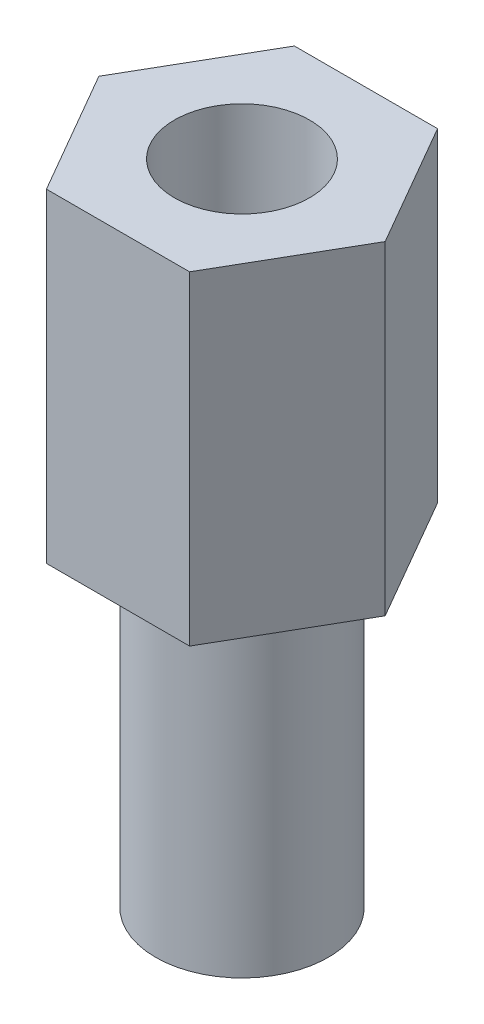
ISO-10303-21;
HEADER;
FILE_DESCRIPTION(('STEP AP214'),'2;1');
FILE_NAME('part.step','',(''),(''),'','','');
FILE_SCHEMA(('AUTOMOTIVE_DESIGN { 1 0 10303 214 1 1 1 1 }'));
ENDSEC;
DATA;
#1=APPLICATION_CONTEXT('core data for automotive mechanical design processes');
#2=APPLICATION_PROTOCOL_DEFINITION('international standard','automotive_design',2000,#1);
#3=PRODUCT_CONTEXT('',#1,'mechanical');
#4=PRODUCT('Part','Part','',(#3));
#5=PRODUCT_RELATED_PRODUCT_CATEGORY('part','',(#4));
#6=PRODUCT_DEFINITION_FORMATION('','',#4);
#7=PRODUCT_DEFINITION_CONTEXT('part definition',#1,'design');
#8=PRODUCT_DEFINITION('design','',#6,#7);
#9=PRODUCT_DEFINITION_SHAPE('','',#8);
#10=(LENGTH_UNIT() NAMED_UNIT(*) SI_UNIT(.MILLI.,.METRE.));
#11=(NAMED_UNIT(*) PLANE_ANGLE_UNIT() SI_UNIT($,.RADIAN.));
#12=(NAMED_UNIT(*) SI_UNIT($,.STERADIAN.) SOLID_ANGLE_UNIT());
#13=UNCERTAINTY_MEASURE_WITH_UNIT(LENGTH_MEASURE(1.E-05),#10,'distance_accuracy_value','');
#14=(GEOMETRIC_REPRESENTATION_CONTEXT(3) GLOBAL_UNCERTAINTY_ASSIGNED_CONTEXT((#13)) GLOBAL_UNIT_ASSIGNED_CONTEXT((#10,
#11,#12)) REPRESENTATION_CONTEXT('',''));
#15=CARTESIAN_POINT('',(0.,0.,0.));
#16=DIRECTION('',(0.,0.,1.));
#17=DIRECTION('',(1.,0.,0.));
#18=AXIS2_PLACEMENT_3D('',#15,#16,#17);
#19=CARTESIAN_POINT('',(-1.325,6.,2.29496732002876));
#20=DIRECTION('',(0.,0.,-1.));
#21=DIRECTION('',(-1.,0.,0.));
#22=AXIS2_PLACEMENT_3D('',#19,#20,#21);
#23=PLANE('',#22);
#24=DIRECTION('',(1.,0.,0.));
#25=VECTOR('',#24,1.);
#26=CARTESIAN_POINT('',(-1.325,0.,2.29496732002876));
#27=LINE('',#26,#25);
#28=CARTESIAN_POINT('',(-1.325,0.,2.29496732002876));
#29=VERTEX_POINT('',#28);
#30=CARTESIAN_POINT('',(1.325,0.,2.29496732002876));
#31=VERTEX_POINT('',#30);
#32=EDGE_CURVE('E124',#29,#31,#27,.T.);
#33=ORIENTED_EDGE('',*,*,#32,.T.);
#34=DIRECTION('',(0.,-1.,0.));
#35=VECTOR('',#34,1.);
#36=CARTESIAN_POINT('',(1.325,6.,2.29496732002876));
#37=LINE('',#36,#35);
#38=CARTESIAN_POINT('',(1.325,6.,2.29496732002876));
#39=VERTEX_POINT('',#38);
#40=EDGE_CURVE('E47',#39,#31,#37,.T.);
#41=ORIENTED_EDGE('',*,*,#40,.F.);
#42=DIRECTION('',(1.,0.,0.));
#43=VECTOR('',#42,1.);
#44=CARTESIAN_POINT('',(-1.325,6.,2.29496732002876));
#45=LINE('',#44,#43);
#46=CARTESIAN_POINT('',(-1.325,6.,2.29496732002876));
#47=VERTEX_POINT('',#46);
#48=EDGE_CURVE('E135',#47,#39,#45,.T.);
#49=ORIENTED_EDGE('',*,*,#48,.F.);
#50=DIRECTION('',(0.,-1.,0.));
#51=VECTOR('',#50,1.);
#52=CARTESIAN_POINT('',(-1.325,6.,2.29496732002876));
#53=LINE('',#52,#51);
#54=EDGE_CURVE('E120',#47,#29,#53,.T.);
#55=ORIENTED_EDGE('',*,*,#54,.T.);
#56=EDGE_LOOP('',(#33,#41,#49,#55));
#57=FACE_BOUND('',#56,.T.);
#58=ADVANCED_FACE('F39',(#57),#23,.F.);
#59=CARTESIAN_POINT('',(1.325,6.,2.29496732002876));
#60=DIRECTION('',(-0.866025403784439,0.,-0.5));
#61=DIRECTION('',(-0.5,0.,0.866025403784439));
#62=AXIS2_PLACEMENT_3D('',#59,#60,#61);
#63=PLANE('',#62);
#64=DIRECTION('',(0.5,0.,-0.866025403784439));
#65=VECTOR('',#64,1.);
#66=CARTESIAN_POINT('',(1.325,0.,2.29496732002876));
#67=LINE('',#66,#65);
#68=CARTESIAN_POINT('',(2.65,0.,0.));
#69=VERTEX_POINT('',#68);
#70=EDGE_CURVE('E127',#31,#69,#67,.T.);
#71=ORIENTED_EDGE('',*,*,#70,.T.);
#72=DIRECTION('',(0.,-1.,0.));
#73=VECTOR('',#72,1.);
#74=CARTESIAN_POINT('',(2.65,6.,0.));
#75=LINE('',#74,#73);
#76=CARTESIAN_POINT('',(2.65,6.,0.));
#77=VERTEX_POINT('',#76);
#78=EDGE_CURVE('E139',#77,#69,#75,.T.);
#79=ORIENTED_EDGE('',*,*,#78,.F.);
#80=DIRECTION('',(0.5,0.,-0.866025403784439));
#81=VECTOR('',#80,1.);
#82=CARTESIAN_POINT('',(1.325,6.,2.29496732002876));
#83=LINE('',#82,#81);
#84=EDGE_CURVE('E93',#39,#77,#83,.T.);
#85=ORIENTED_EDGE('',*,*,#84,.F.);
#86=ORIENTED_EDGE('',*,*,#40,.T.);
#87=EDGE_LOOP('',(#71,#79,#85,#86));
#88=FACE_BOUND('',#87,.T.);
#89=ADVANCED_FACE('F142',(#88),#63,.F.);
#90=CARTESIAN_POINT('',(2.65,6.,0.));
#91=DIRECTION('',(-0.866025403784438,0.,0.5));
#92=DIRECTION('',(0.5,0.,0.866025403784439));
#93=AXIS2_PLACEMENT_3D('',#90,#91,#92);
#94=PLANE('',#93);
#95=DIRECTION('',(-0.5,0.,-0.866025403784439));
#96=VECTOR('',#95,1.);
#97=CARTESIAN_POINT('',(2.65,0.,0.));
#98=LINE('',#97,#96);
#99=CARTESIAN_POINT('',(1.325,0.,-2.29496732002876));
#100=VERTEX_POINT('',#99);
#101=EDGE_CURVE('E130',#69,#100,#98,.T.);
#102=ORIENTED_EDGE('',*,*,#101,.T.);
#103=DIRECTION('',(0.,-1.,0.));
#104=VECTOR('',#103,1.);
#105=CARTESIAN_POINT('',(1.325,6.,-2.29496732002876));
#106=LINE('',#105,#104);
#107=CARTESIAN_POINT('',(1.325,6.,-2.29496732002876));
#108=VERTEX_POINT('',#107);
#109=EDGE_CURVE('E115',#108,#100,#106,.T.);
#110=ORIENTED_EDGE('',*,*,#109,.F.);
#111=DIRECTION('',(-0.5,0.,-0.866025403784439));
#112=VECTOR('',#111,1.);
#113=CARTESIAN_POINT('',(2.65,6.,0.));
#114=LINE('',#113,#112);
#115=EDGE_CURVE('E106',#77,#108,#114,.T.);
#116=ORIENTED_EDGE('',*,*,#115,.F.);
#117=ORIENTED_EDGE('',*,*,#78,.T.);
#118=EDGE_LOOP('',(#102,#110,#116,#117));
#119=FACE_BOUND('',#118,.T.);
#120=ADVANCED_FACE('F150',(#119),#94,.F.);
#121=CARTESIAN_POINT('',(1.325,6.,-2.29496732002876));
#122=DIRECTION('',(0.,0.,1.));
#123=DIRECTION('',(1.,0.,0.));
#124=AXIS2_PLACEMENT_3D('',#121,#122,#123);
#125=PLANE('',#124);
#126=DIRECTION('',(-1.,0.,0.));
#127=VECTOR('',#126,1.);
#128=CARTESIAN_POINT('',(1.325,0.,-2.29496732002876));
#129=LINE('',#128,#127);
#130=CARTESIAN_POINT('',(-1.325,0.,-2.29496732002876));
#131=VERTEX_POINT('',#130);
#132=EDGE_CURVE('E114',#100,#131,#129,.T.);
#133=ORIENTED_EDGE('',*,*,#132,.T.);
#134=DIRECTION('',(0.,-1.,0.));
#135=VECTOR('',#134,1.);
#136=CARTESIAN_POINT('',(-1.325,6.,-2.29496732002876));
#137=LINE('',#136,#135);
#138=CARTESIAN_POINT('',(-1.325,6.,-2.29496732002876));
#139=VERTEX_POINT('',#138);
#140=EDGE_CURVE('E111',#139,#131,#137,.T.);
#141=ORIENTED_EDGE('',*,*,#140,.F.);
#142=DIRECTION('',(-1.,0.,0.));
#143=VECTOR('',#142,1.);
#144=CARTESIAN_POINT('',(1.325,6.,-2.29496732002876));
#145=LINE('',#144,#143);
#146=EDGE_CURVE('E100',#108,#139,#145,.T.);
#147=ORIENTED_EDGE('',*,*,#146,.F.);
#148=ORIENTED_EDGE('',*,*,#109,.T.);
#149=EDGE_LOOP('',(#133,#141,#147,#148));
#150=FACE_BOUND('',#149,.T.);
#151=ADVANCED_FACE('F112',(#150),#125,.F.);
#152=CARTESIAN_POINT('',(-1.325,6.,-2.29496732002876));
#153=DIRECTION('',(0.866025403784439,0.,0.5));
#154=DIRECTION('',(0.5,0.,-0.866025403784439));
#155=AXIS2_PLACEMENT_3D('',#152,#153,#154);
#156=PLANE('',#155);
#157=DIRECTION('',(-0.5,0.,0.866025403784439));
#158=VECTOR('',#157,1.);
#159=CARTESIAN_POINT('',(-1.325,0.,-2.29496732002876));
#160=LINE('',#159,#158);
#161=CARTESIAN_POINT('',(-2.65,0.,0.));
#162=VERTEX_POINT('',#161);
#163=EDGE_CURVE('E78',#131,#162,#160,.T.);
#164=ORIENTED_EDGE('',*,*,#163,.T.);
#165=DIRECTION('',(0.,-1.,0.));
#166=VECTOR('',#165,1.);
#167=CARTESIAN_POINT('',(-2.65,6.,0.));
#168=LINE('',#167,#166);
#169=CARTESIAN_POINT('',(-2.65,6.,0.));
#170=VERTEX_POINT('',#169);
#171=EDGE_CURVE('E116',#170,#162,#168,.T.);
#172=ORIENTED_EDGE('',*,*,#171,.F.);
#173=DIRECTION('',(-0.5,0.,0.866025403784439));
#174=VECTOR('',#173,1.);
#175=CARTESIAN_POINT('',(-1.325,6.,-2.29496732002876));
#176=LINE('',#175,#174);
#177=EDGE_CURVE('E104',#139,#170,#176,.T.);
#178=ORIENTED_EDGE('',*,*,#177,.F.);
#179=ORIENTED_EDGE('',*,*,#140,.T.);
#180=EDGE_LOOP('',(#164,#172,#178,#179));
#181=FACE_BOUND('',#180,.T.);
#182=ADVANCED_FACE('F118',(#181),#156,.F.);
#183=CARTESIAN_POINT('',(-2.65,6.,0.));
#184=DIRECTION('',(0.866025403784438,0.,-0.5));
#185=DIRECTION('',(-0.5,0.,-0.866025403784439));
#186=AXIS2_PLACEMENT_3D('',#183,#184,#185);
#187=PLANE('',#186);
#188=DIRECTION('',(0.5,0.,0.866025403784439));
#189=VECTOR('',#188,1.);
#190=CARTESIAN_POINT('',(-2.65,0.,0.));
#191=LINE('',#190,#189);
#192=EDGE_CURVE('E84',#162,#29,#191,.T.);
#193=ORIENTED_EDGE('',*,*,#192,.T.);
#194=ORIENTED_EDGE('',*,*,#54,.F.);
#195=DIRECTION('',(0.5,0.,0.866025403784439));
#196=VECTOR('',#195,1.);
#197=CARTESIAN_POINT('',(-2.65,6.,0.));
#198=LINE('',#197,#196);
#199=EDGE_CURVE('E55',#170,#47,#198,.T.);
#200=ORIENTED_EDGE('',*,*,#199,.F.);
#201=ORIENTED_EDGE('',*,*,#171,.T.);
#202=EDGE_LOOP('',(#193,#194,#200,#201));
#203=FACE_BOUND('',#202,.T.);
#204=ADVANCED_FACE('F173',(#203),#187,.F.);
#205=CARTESIAN_POINT('',(0.,6.,0.));
#206=DIRECTION('',(0.,1.,0.));
#207=DIRECTION('',(0.,0.,1.));
#208=AXIS2_PLACEMENT_3D('',#205,#206,#207);
#209=PLANE('',#208);
#210=CARTESIAN_POINT('',(0.,6.,0.));
#211=DIRECTION('',(0.,1.,0.));
#212=DIRECTION('',(0.,0.,1.));
#213=AXIS2_PLACEMENT_3D('',#210,#211,#212);
#214=CIRCLE('',#213,1.25);
#215=CARTESIAN_POINT('',(0.,6.,1.25));
#216=VERTEX_POINT('',#215);
#217=EDGE_CURVE('E157',#216,#216,#214,.T.);
#218=ORIENTED_EDGE('',*,*,#217,.F.);
#219=EDGE_LOOP('',(#218));
#220=FACE_BOUND('',#219,.T.);
#221=ORIENTED_EDGE('',*,*,#48,.T.);
#222=ORIENTED_EDGE('',*,*,#84,.T.);
#223=ORIENTED_EDGE('',*,*,#115,.T.);
#224=ORIENTED_EDGE('',*,*,#146,.T.);
#225=ORIENTED_EDGE('',*,*,#177,.T.);
#226=ORIENTED_EDGE('',*,*,#199,.T.);
#227=EDGE_LOOP('',(#221,#222,#223,#224,#225,#226));
#228=FACE_BOUND('',#227,.T.);
#229=ADVANCED_FACE('F102',(#220,#228),#209,.T.);
#230=CARTESIAN_POINT('',(0.,0.,0.));
#231=DIRECTION('',(0.,1.,0.));
#232=DIRECTION('',(0.,0.,1.));
#233=AXIS2_PLACEMENT_3D('',#230,#231,#232);
#234=PLANE('',#233);
#235=CARTESIAN_POINT('',(0.,0.,0.));
#236=DIRECTION('',(0.,1.,0.));
#237=DIRECTION('',(0.,0.,1.));
#238=AXIS2_PLACEMENT_3D('',#235,#236,#237);
#239=CIRCLE('',#238,1.6);
#240=CARTESIAN_POINT('',(0.,0.,1.6));
#241=VERTEX_POINT('',#240);
#242=EDGE_CURVE('E11',#241,#241,#239,.F.);
#243=ORIENTED_EDGE('',*,*,#242,.F.);
#244=EDGE_LOOP('',(#243));
#245=FACE_BOUND('',#244,.T.);
#246=ORIENTED_EDGE('',*,*,#32,.F.);
#247=ORIENTED_EDGE('',*,*,#192,.F.);
#248=ORIENTED_EDGE('',*,*,#163,.F.);
#249=ORIENTED_EDGE('',*,*,#132,.F.);
#250=ORIENTED_EDGE('',*,*,#101,.F.);
#251=ORIENTED_EDGE('',*,*,#70,.F.);
#252=EDGE_LOOP('',(#246,#247,#248,#249,#250,#251));
#253=FACE_BOUND('',#252,.T.);
#254=ADVANCED_FACE('F147',(#245,#253),#234,.F.);
#255=CARTESIAN_POINT('',(0.,-6.,0.));
#256=DIRECTION('',(0.,1.,0.));
#257=DIRECTION('',(0.,0.,1.));
#258=AXIS2_PLACEMENT_3D('',#255,#256,#257);
#259=CYLINDRICAL_SURFACE('',#258,1.6);
#260=CARTESIAN_POINT('',(0.,-6.,0.));
#261=DIRECTION('',(0.,-1.,0.));
#262=DIRECTION('',(0.,0.,-1.));
#263=AXIS2_PLACEMENT_3D('',#260,#261,#262);
#264=CIRCLE('',#263,1.6);
#265=CARTESIAN_POINT('',(0.,-6.,-1.6));
#266=VERTEX_POINT('',#265);
#267=EDGE_CURVE('E128',#266,#266,#264,.T.);
#268=ORIENTED_EDGE('',*,*,#267,.F.);
#269=EDGE_LOOP('',(#268));
#270=FACE_BOUND('',#269,.T.);
#271=ORIENTED_EDGE('',*,*,#242,.T.);
#272=EDGE_LOOP('',(#271));
#273=FACE_BOUND('',#272,.T.);
#274=ADVANCED_FACE('F179',(#270,#273),#259,.T.);
#275=CARTESIAN_POINT('',(0.,-6.,0.));
#276=DIRECTION('',(0.,-1.,0.));
#277=DIRECTION('',(0.,0.,-1.));
#278=AXIS2_PLACEMENT_3D('',#275,#276,#277);
#279=PLANE('',#278);
#280=ORIENTED_EDGE('',*,*,#267,.T.);
#281=EDGE_LOOP('',(#280));
#282=FACE_BOUND('',#281,.T.);
#283=ADVANCED_FACE('F168',(#282),#279,.T.);
#284=CARTESIAN_POINT('',(0.,1.,0.));
#285=DIRECTION('',(0.,1.,0.));
#286=DIRECTION('',(0.,0.,1.));
#287=AXIS2_PLACEMENT_3D('',#284,#285,#286);
#288=CYLINDRICAL_SURFACE('',#287,1.25);
#289=CARTESIAN_POINT('',(0.,1.,0.));
#290=DIRECTION('',(0.,1.,0.));
#291=DIRECTION('',(0.,0.,1.));
#292=AXIS2_PLACEMENT_3D('',#289,#290,#291);
#293=CIRCLE('',#292,1.25);
#294=CARTESIAN_POINT('',(0.,1.,1.25));
#295=VERTEX_POINT('',#294);
#296=EDGE_CURVE('E156',#295,#295,#293,.T.);
#297=ORIENTED_EDGE('',*,*,#296,.F.);
#298=EDGE_LOOP('',(#297));
#299=FACE_BOUND('',#298,.T.);
#300=ORIENTED_EDGE('',*,*,#217,.T.);
#301=EDGE_LOOP('',(#300));
#302=FACE_BOUND('',#301,.T.);
#303=ADVANCED_FACE('F165',(#299,#302),#288,.F.);
#304=CARTESIAN_POINT('',(0.,1.,0.));
#305=DIRECTION('',(0.,1.,0.));
#306=DIRECTION('',(0.,0.,1.));
#307=AXIS2_PLACEMENT_3D('',#304,#305,#306);
#308=PLANE('',#307);
#309=ORIENTED_EDGE('',*,*,#296,.T.);
#310=EDGE_LOOP('',(#309));
#311=FACE_BOUND('',#310,.T.);
#312=ADVANCED_FACE('F163',(#311),#308,.T.);
#313=CLOSED_SHELL('',(#58,#89,#120,#151,#182,#204,#229,#254,#274,#283,#303,#312));
#314=MANIFOLD_SOLID_BREP('B2',#313);
#315=ADVANCED_BREP_SHAPE_REPRESENTATION('',(#18,#314),#14);
#316=SHAPE_DEFINITION_REPRESENTATION(#9,#315);
ENDSEC;
END-ISO-10303-21;
